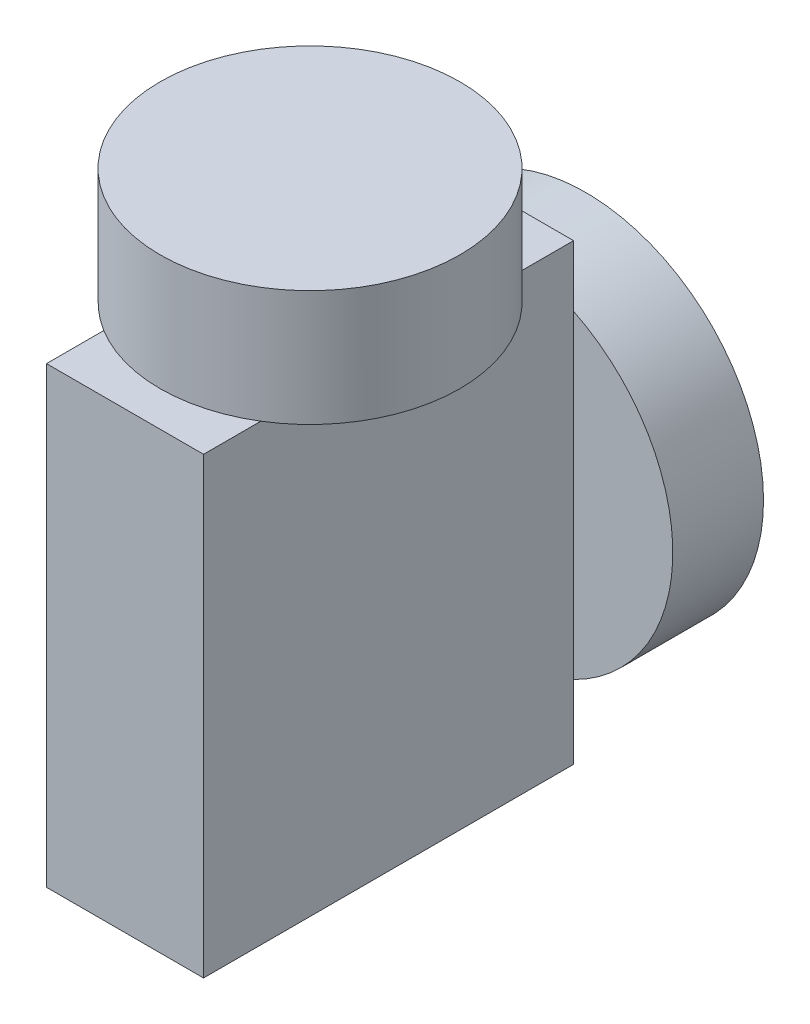
ISO-10303-21;
HEADER;
FILE_DESCRIPTION(('STEP AP214'),'2;1');
FILE_NAME('part.step','',(''),(''),'','','');
FILE_SCHEMA(('AUTOMOTIVE_DESIGN { 1 0 10303 214 1 1 1 1 }'));
ENDSEC;
DATA;
#1=APPLICATION_CONTEXT('core data for automotive mechanical design processes');
#2=APPLICATION_PROTOCOL_DEFINITION('international standard','automotive_design',2000,#1);
#3=PRODUCT_CONTEXT('',#1,'mechanical');
#4=PRODUCT('Part','Part','',(#3));
#5=PRODUCT_RELATED_PRODUCT_CATEGORY('part','',(#4));
#6=PRODUCT_DEFINITION_FORMATION('','',#4);
#7=PRODUCT_DEFINITION_CONTEXT('part definition',#1,'design');
#8=PRODUCT_DEFINITION('design','',#6,#7);
#9=PRODUCT_DEFINITION_SHAPE('','',#8);
#10=(LENGTH_UNIT() NAMED_UNIT(*) SI_UNIT(.MILLI.,.METRE.));
#11=(NAMED_UNIT(*) PLANE_ANGLE_UNIT() SI_UNIT($,.RADIAN.));
#12=(NAMED_UNIT(*) SI_UNIT($,.STERADIAN.) SOLID_ANGLE_UNIT());
#13=UNCERTAINTY_MEASURE_WITH_UNIT(LENGTH_MEASURE(1.E-05),#10,'distance_accuracy_value','');
#14=(GEOMETRIC_REPRESENTATION_CONTEXT(3) GLOBAL_UNCERTAINTY_ASSIGNED_CONTEXT((#13)) GLOBAL_UNIT_ASSIGNED_CONTEXT((#10,
#11,#12)) REPRESENTATION_CONTEXT('',''));
#15=CARTESIAN_POINT('',(0.,0.,0.));
#16=DIRECTION('',(0.,0.,1.));
#17=DIRECTION('',(1.,0.,0.));
#18=AXIS2_PLACEMENT_3D('',#15,#16,#17);
#19=CARTESIAN_POINT('',(15.5828491382864,-90.,-36.7129977051597));
#20=DIRECTION('',(0.,0.,1.));
#21=DIRECTION('',(1.,0.,0.));
#22=AXIS2_PLACEMENT_3D('',#19,#20,#21);
#23=PLANE('',#22);
#24=CARTESIAN_POINT('',(0.,-43.7769647901228,-36.7129977051597));
#25=DIRECTION('',(0.,0.,-1.));
#26=DIRECTION('',(-1.,0.,0.));
#27=AXIS2_PLACEMENT_3D('',#24,#25,#26);
#28=CIRCLE('',#27,35.2739965941938);
#29=CARTESIAN_POINT('',(-15.5828491382864,-12.131591534928,-36.7129977051597));
#30=VERTEX_POINT('',#29);
#31=CARTESIAN_POINT('',(15.5828491382864,-12.131591534928,-36.7129977051597));
#32=VERTEX_POINT('',#31);
#33=EDGE_CURVE('E46',#30,#32,#28,.T.);
#34=ORIENTED_EDGE('',*,*,#33,.F.);
#35=DIRECTION('',(0.,1.,0.));
#36=VECTOR('',#35,1.);
#37=CARTESIAN_POINT('',(-15.5828491382864,-90.,-36.7129977051597));
#38=LINE('',#37,#36);
#39=CARTESIAN_POINT('',(-15.5828491382864,0.,-36.7129977051597));
#40=VERTEX_POINT('',#39);
#41=EDGE_CURVE('E113',#30,#40,#38,.T.);
#42=ORIENTED_EDGE('',*,*,#41,.T.);
#43=DIRECTION('',(1.,0.,0.));
#44=VECTOR('',#43,1.);
#45=CARTESIAN_POINT('',(15.5828491382864,0.,-36.7129977051597));
#46=LINE('',#45,#44);
#47=CARTESIAN_POINT('',(15.5828491382864,0.,-36.7129977051597));
#48=VERTEX_POINT('',#47);
#49=EDGE_CURVE('E143',#40,#48,#46,.T.);
#50=ORIENTED_EDGE('',*,*,#49,.T.);
#51=DIRECTION('',(0.,1.,0.));
#52=VECTOR('',#51,1.);
#53=CARTESIAN_POINT('',(15.5828491382864,-90.,-36.7129977051597));
#54=LINE('',#53,#52);
#55=EDGE_CURVE('E58',#32,#48,#54,.T.);
#56=ORIENTED_EDGE('',*,*,#55,.F.);
#57=EDGE_LOOP('',(#34,#42,#50,#56));
#58=FACE_BOUND('',#57,.T.);
#59=ADVANCED_FACE('F35',(#58),#23,.F.);
#60=CARTESIAN_POINT('',(0.,0.,0.));
#61=DIRECTION('',(0.,1.,0.));
#62=DIRECTION('',(0.,0.,1.));
#63=AXIS2_PLACEMENT_3D('',#60,#61,#62);
#64=PLANE('',#63);
#65=DIRECTION('',(0.,0.,-1.));
#66=VECTOR('',#65,1.);
#67=CARTESIAN_POINT('',(-15.5828491382864,0.,-36.7129977051597));
#68=LINE('',#67,#66);
#69=CARTESIAN_POINT('',(-15.5828491382864,0.,25.3403605371167));
#70=VERTEX_POINT('',#69);
#71=CARTESIAN_POINT('',(-15.5828491382864,0.,-25.3403605371167));
#72=VERTEX_POINT('',#71);
#73=EDGE_CURVE('E44',#70,#72,#68,.T.);
#74=ORIENTED_EDGE('',*,*,#73,.F.);
#75=CARTESIAN_POINT('',(0.,0.,0.));
#76=DIRECTION('',(0.,1.,0.));
#77=DIRECTION('',(0.,0.,1.));
#78=AXIS2_PLACEMENT_3D('',#75,#76,#77);
#79=CIRCLE('',#78,29.7482614520186);
#80=EDGE_CURVE('E170',#72,#70,#79,.T.);
#81=ORIENTED_EDGE('',*,*,#80,.F.);
#82=EDGE_LOOP('',(#74,#81));
#83=FACE_BOUND('',#82,.T.);
#84=ADVANCED_FACE('F193',(#83),#64,.F.);
#85=DIRECTION('',(0.,0.,1.));
#86=VECTOR('',#85,1.);
#87=CARTESIAN_POINT('',(15.5828491382864,0.,-36.7129977051597));
#88=LINE('',#87,#86);
#89=CARTESIAN_POINT('',(15.5828491382864,0.,-25.3403605371167));
#90=VERTEX_POINT('',#89);
#91=CARTESIAN_POINT('',(15.5828491382864,0.,25.3403605371167));
#92=VERTEX_POINT('',#91);
#93=EDGE_CURVE('E150',#90,#92,#88,.T.);
#94=ORIENTED_EDGE('',*,*,#93,.F.);
#95=EDGE_CURVE('E39',#92,#90,#79,.T.);
#96=ORIENTED_EDGE('',*,*,#95,.F.);
#97=EDGE_LOOP('',(#94,#96));
#98=FACE_BOUND('',#97,.T.);
#99=ADVANCED_FACE('F191',(#98),#64,.F.);
#100=CARTESIAN_POINT('',(0.,23.,0.));
#101=DIRECTION('',(0.,-1.,0.));
#102=DIRECTION('',(0.,0.,-1.));
#103=AXIS2_PLACEMENT_3D('',#100,#101,#102);
#104=CYLINDRICAL_SURFACE('',#103,29.7482614520186);
#105=CARTESIAN_POINT('',(0.,23.,0.));
#106=DIRECTION('',(0.,1.,0.));
#107=DIRECTION('',(0.,0.,1.));
#108=AXIS2_PLACEMENT_3D('',#105,#106,#107);
#109=CIRCLE('',#108,29.7482614520186);
#110=CARTESIAN_POINT('',(0.,23.,29.7482614520186));
#111=VERTEX_POINT('',#110);
#112=EDGE_CURVE('E159',#111,#111,#109,.T.);
#113=ORIENTED_EDGE('',*,*,#112,.F.);
#114=EDGE_LOOP('',(#113));
#115=FACE_BOUND('',#114,.T.);
#116=ORIENTED_EDGE('',*,*,#95,.T.);
#117=EDGE_CURVE('E165',#90,#72,#79,.T.);
#118=ORIENTED_EDGE('',*,*,#117,.T.);
#119=ORIENTED_EDGE('',*,*,#80,.T.);
#120=EDGE_CURVE('E110',#70,#92,#79,.T.);
#121=ORIENTED_EDGE('',*,*,#120,.T.);
#122=EDGE_LOOP('',(#116,#118,#119,#121));
#123=FACE_BOUND('',#122,.T.);
#124=ADVANCED_FACE('F37',(#115,#123),#104,.T.);
#125=CARTESIAN_POINT('',(0.,23.,0.));
#126=DIRECTION('',(0.,1.,0.));
#127=DIRECTION('',(0.,0.,1.));
#128=AXIS2_PLACEMENT_3D('',#125,#126,#127);
#129=PLANE('',#128);
#130=ORIENTED_EDGE('',*,*,#112,.T.);
#131=EDGE_LOOP('',(#130));
#132=FACE_BOUND('',#131,.T.);
#133=ADVANCED_FACE('F198',(#132),#129,.T.);
#134=CARTESIAN_POINT('',(0.,0.,0.));
#135=DIRECTION('',(0.,-1.,0.));
#136=DIRECTION('',(0.,0.,-1.));
#137=AXIS2_PLACEMENT_3D('',#134,#135,#136);
#138=PLANE('',#137);
#139=ORIENTED_EDGE('',*,*,#117,.F.);
#140=EDGE_CURVE('E147',#48,#90,#88,.T.);
#141=ORIENTED_EDGE('',*,*,#140,.F.);
#142=ORIENTED_EDGE('',*,*,#49,.F.);
#143=EDGE_CURVE('E144',#72,#40,#68,.T.);
#144=ORIENTED_EDGE('',*,*,#143,.F.);
#145=EDGE_LOOP('',(#139,#141,#142,#144));
#146=FACE_BOUND('',#145,.T.);
#147=ADVANCED_FACE('F212',(#146),#138,.F.);
#148=CARTESIAN_POINT('',(-15.5828491382864,-90.,-36.7129977051597));
#149=DIRECTION('',(1.,0.,0.));
#150=DIRECTION('',(0.,0.,-1.));
#151=AXIS2_PLACEMENT_3D('',#148,#149,#150);
#152=PLANE('',#151);
#153=CARTESIAN_POINT('',(-15.5828491382864,0.,36.7129977051597));
#154=VERTEX_POINT('',#153);
#155=EDGE_CURVE('E141',#154,#70,#68,.T.);
#156=ORIENTED_EDGE('',*,*,#155,.T.);
#157=ORIENTED_EDGE('',*,*,#73,.T.);
#158=ORIENTED_EDGE('',*,*,#143,.T.);
#159=ORIENTED_EDGE('',*,*,#41,.F.);
#160=CARTESIAN_POINT('',(-15.5828491382864,-75.4223380453176,-36.7129977051597));
#161=VERTEX_POINT('',#160);
#162=EDGE_CURVE('E111',#161,#30,#38,.T.);
#163=ORIENTED_EDGE('',*,*,#162,.F.);
#164=CARTESIAN_POINT('',(-15.5828491382864,-90.,-36.7129977051597));
#165=VERTEX_POINT('',#164);
#166=EDGE_CURVE('E101',#165,#161,#38,.T.);
#167=ORIENTED_EDGE('',*,*,#166,.F.);
#168=DIRECTION('',(0.,0.,-1.));
#169=VECTOR('',#168,1.);
#170=CARTESIAN_POINT('',(-15.5828491382864,-90.,-36.7129977051597));
#171=LINE('',#170,#169);
#172=CARTESIAN_POINT('',(-15.5828491382864,-90.,36.7129977051597));
#173=VERTEX_POINT('',#172);
#174=EDGE_CURVE('E132',#173,#165,#171,.T.);
#175=ORIENTED_EDGE('',*,*,#174,.F.);
#176=DIRECTION('',(0.,1.,0.));
#177=VECTOR('',#176,1.);
#178=CARTESIAN_POINT('',(-15.5828491382864,-90.,36.7129977051597));
#179=LINE('',#178,#177);
#180=EDGE_CURVE('E140',#173,#154,#179,.T.);
#181=ORIENTED_EDGE('',*,*,#180,.T.);
#182=EDGE_LOOP('',(#156,#157,#158,#159,#163,#167,#175,#181));
#183=FACE_BOUND('',#182,.T.);
#184=ADVANCED_FACE('F117',(#183),#152,.F.);
#185=CARTESIAN_POINT('',(15.5828491382864,-75.4223380453176,-36.7129977051597));
#186=VERTEX_POINT('',#185);
#187=EDGE_CURVE('E11',#186,#161,#28,.T.);
#188=ORIENTED_EDGE('',*,*,#187,.F.);
#189=CARTESIAN_POINT('',(15.5828491382864,-90.,-36.7129977051597));
#190=VERTEX_POINT('',#189);
#191=EDGE_CURVE('E157',#190,#186,#54,.T.);
#192=ORIENTED_EDGE('',*,*,#191,.F.);
#193=DIRECTION('',(1.,0.,0.));
#194=VECTOR('',#193,1.);
#195=CARTESIAN_POINT('',(15.5828491382864,-90.,-36.7129977051597));
#196=LINE('',#195,#194);
#197=EDGE_CURVE('E106',#165,#190,#196,.T.);
#198=ORIENTED_EDGE('',*,*,#197,.F.);
#199=ORIENTED_EDGE('',*,*,#166,.T.);
#200=EDGE_LOOP('',(#188,#192,#198,#199));
#201=FACE_BOUND('',#200,.T.);
#202=ADVANCED_FACE('F103',(#201),#23,.F.);
#203=CARTESIAN_POINT('',(15.5828491382864,-90.,-36.7129977051597));
#204=DIRECTION('',(-1.,0.,0.));
#205=DIRECTION('',(0.,0.,1.));
#206=AXIS2_PLACEMENT_3D('',#203,#204,#205);
#207=PLANE('',#206);
#208=ORIENTED_EDGE('',*,*,#140,.T.);
#209=ORIENTED_EDGE('',*,*,#93,.T.);
#210=CARTESIAN_POINT('',(15.5828491382864,0.,36.7129977051597));
#211=VERTEX_POINT('',#210);
#212=EDGE_CURVE('E146',#92,#211,#88,.T.);
#213=ORIENTED_EDGE('',*,*,#212,.T.);
#214=DIRECTION('',(0.,1.,0.));
#215=VECTOR('',#214,1.);
#216=CARTESIAN_POINT('',(15.5828491382864,-90.,36.7129977051597));
#217=LINE('',#216,#215);
#218=CARTESIAN_POINT('',(15.5828491382864,-90.,36.7129977051597));
#219=VERTEX_POINT('',#218);
#220=EDGE_CURVE('E154',#219,#211,#217,.T.);
#221=ORIENTED_EDGE('',*,*,#220,.F.);
#222=DIRECTION('',(0.,0.,1.));
#223=VECTOR('',#222,1.);
#224=CARTESIAN_POINT('',(15.5828491382864,-90.,-36.7129977051597));
#225=LINE('',#224,#223);
#226=EDGE_CURVE('E136',#190,#219,#225,.T.);
#227=ORIENTED_EDGE('',*,*,#226,.F.);
#228=ORIENTED_EDGE('',*,*,#191,.T.);
#229=EDGE_CURVE('E158',#186,#32,#54,.T.);
#230=ORIENTED_EDGE('',*,*,#229,.T.);
#231=ORIENTED_EDGE('',*,*,#55,.T.);
#232=EDGE_LOOP('',(#208,#209,#213,#221,#227,#228,#230,#231));
#233=FACE_BOUND('',#232,.T.);
#234=ADVANCED_FACE('F188',(#233),#207,.F.);
#235=CARTESIAN_POINT('',(15.5828491382864,-90.,36.7129977051597));
#236=DIRECTION('',(0.,0.,-1.));
#237=DIRECTION('',(-1.,0.,0.));
#238=AXIS2_PLACEMENT_3D('',#235,#236,#237);
#239=PLANE('',#238);
#240=DIRECTION('',(-1.,0.,0.));
#241=VECTOR('',#240,1.);
#242=CARTESIAN_POINT('',(15.5828491382864,0.,36.7129977051597));
#243=LINE('',#242,#241);
#244=EDGE_CURVE('E134',#211,#154,#243,.T.);
#245=ORIENTED_EDGE('',*,*,#244,.T.);
#246=ORIENTED_EDGE('',*,*,#180,.F.);
#247=DIRECTION('',(-1.,0.,0.));
#248=VECTOR('',#247,1.);
#249=CARTESIAN_POINT('',(15.5828491382864,-90.,36.7129977051597));
#250=LINE('',#249,#248);
#251=EDGE_CURVE('E138',#219,#173,#250,.T.);
#252=ORIENTED_EDGE('',*,*,#251,.F.);
#253=ORIENTED_EDGE('',*,*,#220,.T.);
#254=EDGE_LOOP('',(#245,#246,#252,#253));
#255=FACE_BOUND('',#254,.T.);
#256=ADVANCED_FACE('F184',(#255),#239,.F.);
#257=CARTESIAN_POINT('',(0.,-90.,0.));
#258=DIRECTION('',(0.,-1.,0.));
#259=DIRECTION('',(0.,0.,-1.));
#260=AXIS2_PLACEMENT_3D('',#257,#258,#259);
#261=PLANE('',#260);
#262=ORIENTED_EDGE('',*,*,#174,.T.);
#263=ORIENTED_EDGE('',*,*,#197,.T.);
#264=ORIENTED_EDGE('',*,*,#226,.T.);
#265=ORIENTED_EDGE('',*,*,#251,.T.);
#266=EDGE_LOOP('',(#262,#263,#264,#265));
#267=FACE_BOUND('',#266,.T.);
#268=ADVANCED_FACE('F241',(#267),#261,.T.);
#269=ORIENTED_EDGE('',*,*,#120,.F.);
#270=ORIENTED_EDGE('',*,*,#155,.F.);
#271=ORIENTED_EDGE('',*,*,#244,.F.);
#272=ORIENTED_EDGE('',*,*,#212,.F.);
#273=EDGE_LOOP('',(#269,#270,#271,#272));
#274=FACE_BOUND('',#273,.T.);
#275=ADVANCED_FACE('F178',(#274),#138,.F.);
#276=CARTESIAN_POINT('',(0.,-43.7769647901228,-36.7129977051597));
#277=DIRECTION('',(0.,0.,-1.));
#278=DIRECTION('',(-1.,0.,0.));
#279=AXIS2_PLACEMENT_3D('',#276,#277,#278);
#280=PLANE('',#279);
#281=EDGE_CURVE('E121',#161,#30,#28,.T.);
#282=ORIENTED_EDGE('',*,*,#281,.F.);
#283=ORIENTED_EDGE('',*,*,#162,.T.);
#284=EDGE_LOOP('',(#282,#283));
#285=FACE_BOUND('',#284,.T.);
#286=ADVANCED_FACE('F122',(#285),#280,.F.);
#287=CARTESIAN_POINT('',(0.,-43.7769647901228,-54.7129977051597));
#288=DIRECTION('',(0.,0.,1.));
#289=DIRECTION('',(1.,0.,0.));
#290=AXIS2_PLACEMENT_3D('',#287,#288,#289);
#291=CYLINDRICAL_SURFACE('',#290,35.2739965941938);
#292=CARTESIAN_POINT('',(0.,-43.7769647901228,-54.7129977051597));
#293=DIRECTION('',(0.,0.,-1.));
#294=DIRECTION('',(-1.,0.,0.));
#295=AXIS2_PLACEMENT_3D('',#292,#293,#294);
#296=CIRCLE('',#295,35.2739965941938);
#297=CARTESIAN_POINT('',(-35.2739965941938,-43.7769647901228,-54.7129977051597));
#298=VERTEX_POINT('',#297);
#299=EDGE_CURVE('E129',#298,#298,#296,.T.);
#300=ORIENTED_EDGE('',*,*,#299,.F.);
#301=EDGE_LOOP('',(#300));
#302=FACE_BOUND('',#301,.T.);
#303=ORIENTED_EDGE('',*,*,#33,.T.);
#304=EDGE_CURVE('E47',#32,#186,#28,.T.);
#305=ORIENTED_EDGE('',*,*,#304,.T.);
#306=ORIENTED_EDGE('',*,*,#187,.T.);
#307=ORIENTED_EDGE('',*,*,#281,.T.);
#308=EDGE_LOOP('',(#303,#305,#306,#307));
#309=FACE_BOUND('',#308,.T.);
#310=ADVANCED_FACE('F125',(#302,#309),#291,.T.);
#311=CARTESIAN_POINT('',(0.,-43.7769647901228,-54.7129977051597));
#312=DIRECTION('',(0.,0.,-1.));
#313=DIRECTION('',(-1.,0.,0.));
#314=AXIS2_PLACEMENT_3D('',#311,#312,#313);
#315=PLANE('',#314);
#316=ORIENTED_EDGE('',*,*,#299,.T.);
#317=EDGE_LOOP('',(#316));
#318=FACE_BOUND('',#317,.T.);
#319=ADVANCED_FACE('F292',(#318),#315,.T.);
#320=ORIENTED_EDGE('',*,*,#229,.F.);
#321=ORIENTED_EDGE('',*,*,#304,.F.);
#322=EDGE_LOOP('',(#320,#321));
#323=FACE_BOUND('',#322,.T.);
#324=ADVANCED_FACE('F284',(#323),#280,.F.);
#325=CLOSED_SHELL('',(#59,#84,#99,#124,#133,#147,#184,#202,#234,#256,#268,#275,#286,#310,#319,#324));
#326=MANIFOLD_SOLID_BREP('B2',#325);
#327=ADVANCED_BREP_SHAPE_REPRESENTATION('',(#18,#326),#14);
#328=SHAPE_DEFINITION_REPRESENTATION(#9,#327);
ENDSEC;
END-ISO-10303-21;
